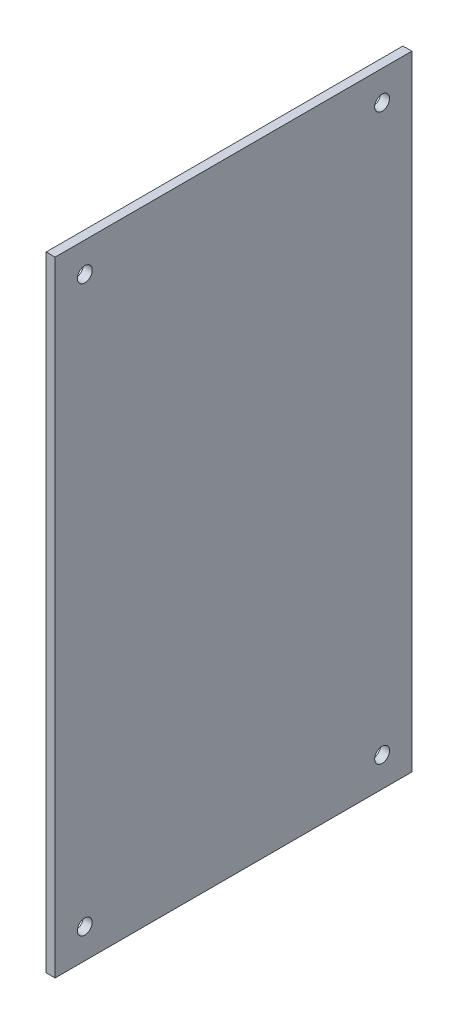
ISO-10303-21;
HEADER;
FILE_DESCRIPTION(('STEP AP214'),'2;1');
FILE_NAME('part.step','',(''),(''),'','','');
FILE_SCHEMA(('AUTOMOTIVE_DESIGN { 1 0 10303 214 1 1 1 1 }'));
ENDSEC;
DATA;
#1=APPLICATION_CONTEXT('core data for automotive mechanical design processes');
#2=APPLICATION_PROTOCOL_DEFINITION('international standard','automotive_design',2000,#1);
#3=PRODUCT_CONTEXT('',#1,'mechanical');
#4=PRODUCT('Part','Part','',(#3));
#5=PRODUCT_RELATED_PRODUCT_CATEGORY('part','',(#4));
#6=PRODUCT_DEFINITION_FORMATION('','',#4);
#7=PRODUCT_DEFINITION_CONTEXT('part definition',#1,'design');
#8=PRODUCT_DEFINITION('design','',#6,#7);
#9=PRODUCT_DEFINITION_SHAPE('','',#8);
#10=(LENGTH_UNIT() NAMED_UNIT(*) SI_UNIT(.MILLI.,.METRE.));
#11=(NAMED_UNIT(*) PLANE_ANGLE_UNIT() SI_UNIT($,.RADIAN.));
#12=(NAMED_UNIT(*) SI_UNIT($,.STERADIAN.) SOLID_ANGLE_UNIT());
#13=UNCERTAINTY_MEASURE_WITH_UNIT(LENGTH_MEASURE(1.E-05),#10,'distance_accuracy_value','');
#14=(GEOMETRIC_REPRESENTATION_CONTEXT(3) GLOBAL_UNCERTAINTY_ASSIGNED_CONTEXT((#13)) GLOBAL_UNIT_ASSIGNED_CONTEXT((#10,
#11,#12)) REPRESENTATION_CONTEXT('',''));
#15=CARTESIAN_POINT('',(0.,0.,0.));
#16=DIRECTION('',(0.,0.,1.));
#17=DIRECTION('',(1.,0.,0.));
#18=AXIS2_PLACEMENT_3D('',#15,#16,#17);
#19=CARTESIAN_POINT('',(193.000000000001,0.,-1.11612023289997E-12));
#20=DIRECTION('',(1.,0.,0.));
#21=DIRECTION('',(0.,0.,-1.));
#22=AXIS2_PLACEMENT_3D('',#19,#20,#21);
#23=PLANE('',#22);
#24=CARTESIAN_POINT('',(193.,20.0000000000011,-99.9999999999982));
#25=DIRECTION('',(1.,0.,0.));
#26=DIRECTION('',(0.,0.,-1.));
#27=AXIS2_PLACEMENT_3D('',#24,#25,#26);
#28=CIRCLE('',#27,2.5);
#29=CARTESIAN_POINT('',(193.,20.0000000000011,-102.499999999998));
#30=VERTEX_POINT('',#29);
#31=EDGE_CURVE('E129',#30,#30,#28,.T.);
#32=ORIENTED_EDGE('',*,*,#31,.F.);
#33=EDGE_LOOP('',(#32));
#34=FACE_BOUND('',#33,.T.);
#35=CARTESIAN_POINT('',(193.,210.,-1.12951392381649E-12));
#36=DIRECTION('',(1.,0.,0.));
#37=DIRECTION('',(0.,0.,-1.));
#38=AXIS2_PLACEMENT_3D('',#35,#36,#37);
#39=CIRCLE('',#38,2.5);
#40=CARTESIAN_POINT('',(193.,210.,-2.50000000000113));
#41=VERTEX_POINT('',#40);
#42=EDGE_CURVE('E108',#41,#41,#39,.T.);
#43=ORIENTED_EDGE('',*,*,#42,.F.);
#44=EDGE_LOOP('',(#43));
#45=FACE_BOUND('',#44,.T.);
#46=DIRECTION('',(0.,-1.,0.));
#47=VECTOR('',#46,1.);
#48=CARTESIAN_POINT('',(193.000000000001,220.,9.99999999999999));
#49=LINE('',#48,#47);
#50=CARTESIAN_POINT('',(193.000000000001,220.,9.99999999999999));
#51=VERTEX_POINT('',#50);
#52=CARTESIAN_POINT('',(193.000000000001,10.0000000000011,10.0000000000003));
#53=VERTEX_POINT('',#52);
#54=EDGE_CURVE('E93',#51,#53,#49,.T.);
#55=ORIENTED_EDGE('',*,*,#54,.T.);
#56=DIRECTION('',(0.,0.,-1.));
#57=VECTOR('',#56,1.);
#58=CARTESIAN_POINT('',(193.000000000001,10.0000000000011,10.0000000000003));
#59=LINE('',#58,#57);
#60=CARTESIAN_POINT('',(193.,10.0000000000011,-110.));
#61=VERTEX_POINT('',#60);
#62=EDGE_CURVE('E88',#53,#61,#59,.T.);
#63=ORIENTED_EDGE('',*,*,#62,.T.);
#64=DIRECTION('',(0.,1.,0.));
#65=VECTOR('',#64,1.);
#66=CARTESIAN_POINT('',(193.,220.,-110.));
#67=LINE('',#66,#65);
#68=CARTESIAN_POINT('',(193.,220.,-110.));
#69=VERTEX_POINT('',#68);
#70=EDGE_CURVE('E91',#61,#69,#67,.T.);
#71=ORIENTED_EDGE('',*,*,#70,.T.);
#72=DIRECTION('',(0.,0.,1.));
#73=VECTOR('',#72,1.);
#74=CARTESIAN_POINT('',(193.000000000001,220.,9.99999999999999));
#75=LINE('',#74,#73);
#76=EDGE_CURVE('E58',#69,#51,#75,.T.);
#77=ORIENTED_EDGE('',*,*,#76,.T.);
#78=EDGE_LOOP('',(#55,#63,#71,#77));
#79=FACE_BOUND('',#78,.T.);
#80=CARTESIAN_POINT('',(193.,210.,-99.9999999999986));
#81=DIRECTION('',(1.,0.,0.));
#82=DIRECTION('',(0.,0.,1.));
#83=AXIS2_PLACEMENT_3D('',#80,#81,#82);
#84=CIRCLE('',#83,2.50000000000001);
#85=CARTESIAN_POINT('',(193.,210.,-97.4999999999986));
#86=VERTEX_POINT('',#85);
#87=EDGE_CURVE('E123',#86,#86,#84,.T.);
#88=ORIENTED_EDGE('',*,*,#87,.F.);
#89=EDGE_LOOP('',(#88));
#90=FACE_BOUND('',#89,.T.);
#91=CARTESIAN_POINT('',(193.000000000001,20.0000000000011,-1.11767644271599E-12));
#92=DIRECTION('',(1.,0.,0.));
#93=DIRECTION('',(0.,0.,1.));
#94=AXIS2_PLACEMENT_3D('',#91,#92,#93);
#95=CIRCLE('',#94,2.5);
#96=CARTESIAN_POINT('',(193.000000000001,20.0000000000011,2.49999999999888));
#97=VERTEX_POINT('',#96);
#98=EDGE_CURVE('E135',#97,#97,#95,.T.);
#99=ORIENTED_EDGE('',*,*,#98,.F.);
#100=EDGE_LOOP('',(#99));
#101=FACE_BOUND('',#100,.T.);
#102=ADVANCED_FACE('F41',(#34,#45,#79,#90,#101),#23,.T.);
#103=CARTESIAN_POINT('',(190.000000000001,0.,-1.09865820145198E-12));
#104=DIRECTION('',(1.,0.,0.));
#105=DIRECTION('',(0.,0.,-1.));
#106=AXIS2_PLACEMENT_3D('',#103,#104,#105);
#107=PLANE('',#106);
#108=DIRECTION('',(0.,-1.,0.));
#109=VECTOR('',#108,1.);
#110=CARTESIAN_POINT('',(190.000000000001,220.,10.));
#111=LINE('',#110,#109);
#112=CARTESIAN_POINT('',(190.000000000001,220.,10.));
#113=VERTEX_POINT('',#112);
#114=CARTESIAN_POINT('',(190.000000000001,10.0000000000011,10.0000000000003));
#115=VERTEX_POINT('',#114);
#116=EDGE_CURVE('E105',#113,#115,#111,.T.);
#117=ORIENTED_EDGE('',*,*,#116,.F.);
#118=DIRECTION('',(0.,0.,1.));
#119=VECTOR('',#118,1.);
#120=CARTESIAN_POINT('',(190.000000000001,220.,10.));
#121=LINE('',#120,#119);
#122=CARTESIAN_POINT('',(190.,220.,-110.));
#123=VERTEX_POINT('',#122);
#124=EDGE_CURVE('E81',#123,#113,#121,.T.);
#125=ORIENTED_EDGE('',*,*,#124,.F.);
#126=DIRECTION('',(0.,1.,0.));
#127=VECTOR('',#126,1.);
#128=CARTESIAN_POINT('',(190.,220.,-110.));
#129=LINE('',#128,#127);
#130=CARTESIAN_POINT('',(190.,10.0000000000011,-110.));
#131=VERTEX_POINT('',#130);
#132=EDGE_CURVE('E75',#131,#123,#129,.T.);
#133=ORIENTED_EDGE('',*,*,#132,.F.);
#134=DIRECTION('',(0.,0.,-1.));
#135=VECTOR('',#134,1.);
#136=CARTESIAN_POINT('',(190.000000000001,10.0000000000011,10.0000000000003));
#137=LINE('',#136,#135);
#138=EDGE_CURVE('E97',#115,#131,#137,.T.);
#139=ORIENTED_EDGE('',*,*,#138,.F.);
#140=EDGE_LOOP('',(#117,#125,#133,#139));
#141=FACE_BOUND('',#140,.T.);
#142=CARTESIAN_POINT('',(190.,210.,-1.1120518923685E-12));
#143=DIRECTION('',(1.,0.,0.));
#144=DIRECTION('',(0.,0.,-1.));
#145=AXIS2_PLACEMENT_3D('',#142,#143,#144);
#146=CIRCLE('',#145,2.5);
#147=CARTESIAN_POINT('',(190.,210.,-2.50000000000111));
#148=VERTEX_POINT('',#147);
#149=EDGE_CURVE('E120',#148,#148,#146,.T.);
#150=ORIENTED_EDGE('',*,*,#149,.T.);
#151=EDGE_LOOP('',(#150));
#152=FACE_BOUND('',#151,.T.);
#153=CARTESIAN_POINT('',(190.,210.,-99.9999999999986));
#154=DIRECTION('',(1.,0.,0.));
#155=DIRECTION('',(0.,0.,1.));
#156=AXIS2_PLACEMENT_3D('',#153,#154,#155);
#157=CIRCLE('',#156,2.50000000000001);
#158=CARTESIAN_POINT('',(190.,210.,-97.4999999999986));
#159=VERTEX_POINT('',#158);
#160=EDGE_CURVE('E126',#159,#159,#157,.T.);
#161=ORIENTED_EDGE('',*,*,#160,.T.);
#162=EDGE_LOOP('',(#161));
#163=FACE_BOUND('',#162,.T.);
#164=CARTESIAN_POINT('',(190.,20.0000000000011,-99.9999999999982));
#165=DIRECTION('',(1.,0.,0.));
#166=DIRECTION('',(0.,0.,-1.));
#167=AXIS2_PLACEMENT_3D('',#164,#165,#166);
#168=CIRCLE('',#167,2.5);
#169=CARTESIAN_POINT('',(190.,20.0000000000011,-102.499999999998));
#170=VERTEX_POINT('',#169);
#171=EDGE_CURVE('E132',#170,#170,#168,.T.);
#172=ORIENTED_EDGE('',*,*,#171,.T.);
#173=EDGE_LOOP('',(#172));
#174=FACE_BOUND('',#173,.T.);
#175=CARTESIAN_POINT('',(190.000000000001,20.0000000000011,-1.100214411268E-12));
#176=DIRECTION('',(1.,0.,0.));
#177=DIRECTION('',(0.,0.,1.));
#178=AXIS2_PLACEMENT_3D('',#175,#176,#177);
#179=CIRCLE('',#178,2.5);
#180=CARTESIAN_POINT('',(190.000000000001,20.0000000000011,2.4999999999989));
#181=VERTEX_POINT('',#180);
#182=EDGE_CURVE('E138',#181,#181,#179,.T.);
#183=ORIENTED_EDGE('',*,*,#182,.T.);
#184=EDGE_LOOP('',(#183));
#185=FACE_BOUND('',#184,.T.);
#186=ADVANCED_FACE('F116',(#141,#152,#163,#174,#185),#107,.F.);
#187=CARTESIAN_POINT('',(193.000000000001,220.,9.99999999999999));
#188=DIRECTION('',(0.,0.,-1.));
#189=DIRECTION('',(-1.,0.,0.));
#190=AXIS2_PLACEMENT_3D('',#187,#188,#189);
#191=PLANE('',#190);
#192=ORIENTED_EDGE('',*,*,#116,.T.);
#193=DIRECTION('',(-1.,0.,0.));
#194=VECTOR('',#193,1.);
#195=CARTESIAN_POINT('',(193.000000000001,10.0000000000011,10.0000000000003));
#196=LINE('',#195,#194);
#197=EDGE_CURVE('E11',#53,#115,#196,.T.);
#198=ORIENTED_EDGE('',*,*,#197,.F.);
#199=ORIENTED_EDGE('',*,*,#54,.F.);
#200=DIRECTION('',(-1.,0.,0.));
#201=VECTOR('',#200,1.);
#202=CARTESIAN_POINT('',(193.000000000001,220.,9.99999999999999));
#203=LINE('',#202,#201);
#204=EDGE_CURVE('E101',#51,#113,#203,.T.);
#205=ORIENTED_EDGE('',*,*,#204,.T.);
#206=EDGE_LOOP('',(#192,#198,#199,#205));
#207=FACE_BOUND('',#206,.T.);
#208=ADVANCED_FACE('F43',(#207),#191,.F.);
#209=CARTESIAN_POINT('',(193.000000000001,10.0000000000011,10.0000000000003));
#210=DIRECTION('',(0.,1.,0.));
#211=DIRECTION('',(-1.,0.,0.));
#212=AXIS2_PLACEMENT_3D('',#209,#210,#211);
#213=PLANE('',#212);
#214=ORIENTED_EDGE('',*,*,#138,.T.);
#215=DIRECTION('',(-1.,0.,0.));
#216=VECTOR('',#215,1.);
#217=CARTESIAN_POINT('',(193.,10.0000000000011,-110.));
#218=LINE('',#217,#216);
#219=EDGE_CURVE('E50',#61,#131,#218,.T.);
#220=ORIENTED_EDGE('',*,*,#219,.F.);
#221=ORIENTED_EDGE('',*,*,#62,.F.);
#222=ORIENTED_EDGE('',*,*,#197,.T.);
#223=EDGE_LOOP('',(#214,#220,#221,#222));
#224=FACE_BOUND('',#223,.T.);
#225=ADVANCED_FACE('F96',(#224),#213,.F.);
#226=CARTESIAN_POINT('',(193.,220.,-110.));
#227=DIRECTION('',(0.,0.,1.));
#228=DIRECTION('',(1.,0.,0.));
#229=AXIS2_PLACEMENT_3D('',#226,#227,#228);
#230=PLANE('',#229);
#231=ORIENTED_EDGE('',*,*,#132,.T.);
#232=DIRECTION('',(-1.,0.,0.));
#233=VECTOR('',#232,1.);
#234=CARTESIAN_POINT('',(193.,220.,-110.));
#235=LINE('',#234,#233);
#236=EDGE_CURVE('E98',#69,#123,#235,.T.);
#237=ORIENTED_EDGE('',*,*,#236,.F.);
#238=ORIENTED_EDGE('',*,*,#70,.F.);
#239=ORIENTED_EDGE('',*,*,#219,.T.);
#240=EDGE_LOOP('',(#231,#237,#238,#239));
#241=FACE_BOUND('',#240,.T.);
#242=ADVANCED_FACE('F99',(#241),#230,.F.);
#243=CARTESIAN_POINT('',(193.000000000001,220.,9.99999999999999));
#244=DIRECTION('',(0.,-1.,0.));
#245=DIRECTION('',(0.,0.,-1.));
#246=AXIS2_PLACEMENT_3D('',#243,#244,#245);
#247=PLANE('',#246);
#248=ORIENTED_EDGE('',*,*,#124,.T.);
#249=ORIENTED_EDGE('',*,*,#204,.F.);
#250=ORIENTED_EDGE('',*,*,#76,.F.);
#251=ORIENTED_EDGE('',*,*,#236,.T.);
#252=EDGE_LOOP('',(#248,#249,#250,#251));
#253=FACE_BOUND('',#252,.T.);
#254=ADVANCED_FACE('F113',(#253),#247,.F.);
#255=CARTESIAN_POINT('',(193.,210.,-1.12951392381649E-12));
#256=DIRECTION('',(-1.,0.,0.));
#257=DIRECTION('',(0.,0.,1.));
#258=AXIS2_PLACEMENT_3D('',#255,#256,#257);
#259=CYLINDRICAL_SURFACE('',#258,2.5);
#260=ORIENTED_EDGE('',*,*,#42,.T.);
#261=EDGE_LOOP('',(#260));
#262=FACE_BOUND('',#261,.T.);
#263=ORIENTED_EDGE('',*,*,#149,.F.);
#264=EDGE_LOOP('',(#263));
#265=FACE_BOUND('',#264,.T.);
#266=ADVANCED_FACE('F157',(#262,#265),#259,.F.);
#267=CARTESIAN_POINT('',(193.,210.,-99.9999999999986));
#268=DIRECTION('',(-1.,0.,0.));
#269=DIRECTION('',(0.,0.,1.));
#270=AXIS2_PLACEMENT_3D('',#267,#268,#269);
#271=CYLINDRICAL_SURFACE('',#270,2.50000000000001);
#272=ORIENTED_EDGE('',*,*,#87,.T.);
#273=EDGE_LOOP('',(#272));
#274=FACE_BOUND('',#273,.T.);
#275=ORIENTED_EDGE('',*,*,#160,.F.);
#276=EDGE_LOOP('',(#275));
#277=FACE_BOUND('',#276,.T.);
#278=ADVANCED_FACE('F220',(#274,#277),#271,.F.);
#279=CARTESIAN_POINT('',(193.,20.0000000000011,-99.9999999999982));
#280=DIRECTION('',(-1.,0.,0.));
#281=DIRECTION('',(0.,0.,1.));
#282=AXIS2_PLACEMENT_3D('',#279,#280,#281);
#283=CYLINDRICAL_SURFACE('',#282,2.5);
#284=ORIENTED_EDGE('',*,*,#31,.T.);
#285=EDGE_LOOP('',(#284));
#286=FACE_BOUND('',#285,.T.);
#287=ORIENTED_EDGE('',*,*,#171,.F.);
#288=EDGE_LOOP('',(#287));
#289=FACE_BOUND('',#288,.T.);
#290=ADVANCED_FACE('F228',(#286,#289),#283,.F.);
#291=CARTESIAN_POINT('',(193.000000000001,20.0000000000011,-1.11767644271599E-12));
#292=DIRECTION('',(-1.,0.,0.));
#293=DIRECTION('',(0.,0.,1.));
#294=AXIS2_PLACEMENT_3D('',#291,#292,#293);
#295=CYLINDRICAL_SURFACE('',#294,2.5);
#296=ORIENTED_EDGE('',*,*,#98,.T.);
#297=EDGE_LOOP('',(#296));
#298=FACE_BOUND('',#297,.T.);
#299=ORIENTED_EDGE('',*,*,#182,.F.);
#300=EDGE_LOOP('',(#299));
#301=FACE_BOUND('',#300,.T.);
#302=ADVANCED_FACE('F144',(#298,#301),#295,.F.);
#303=CLOSED_SHELL('',(#102,#186,#208,#225,#242,#254,#266,#278,#290,#302));
#304=MANIFOLD_SOLID_BREP('B2',#303);
#305=ADVANCED_BREP_SHAPE_REPRESENTATION('',(#18,#304),#14);
#306=SHAPE_DEFINITION_REPRESENTATION(#9,#305);
ENDSEC;
END-ISO-10303-21;
